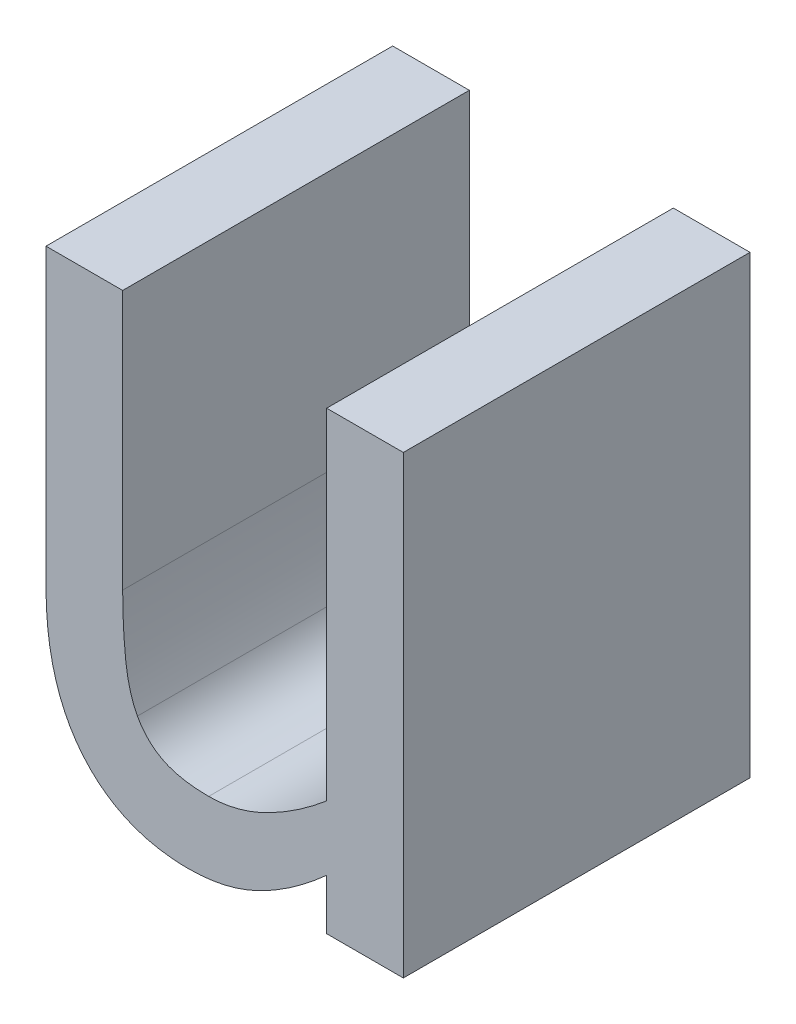
ISO-10303-21;
HEADER;
FILE_DESCRIPTION(('STEP AP214'),'2;1');
FILE_NAME('part.step','',(''),(''),'','','');
FILE_SCHEMA(('AUTOMOTIVE_DESIGN { 1 0 10303 214 1 1 1 1 }'));
ENDSEC;
DATA;
#1=APPLICATION_CONTEXT('core data for automotive mechanical design processes');
#2=APPLICATION_PROTOCOL_DEFINITION('international standard','automotive_design',2000,#1);
#3=PRODUCT_CONTEXT('',#1,'mechanical');
#4=PRODUCT('Part','Part','',(#3));
#5=PRODUCT_RELATED_PRODUCT_CATEGORY('part','',(#4));
#6=PRODUCT_DEFINITION_FORMATION('','',#4);
#7=PRODUCT_DEFINITION_CONTEXT('part definition',#1,'design');
#8=PRODUCT_DEFINITION('design','',#6,#7);
#9=PRODUCT_DEFINITION_SHAPE('','',#8);
#10=(LENGTH_UNIT() NAMED_UNIT(*) SI_UNIT(.MILLI.,.METRE.));
#11=(NAMED_UNIT(*) PLANE_ANGLE_UNIT() SI_UNIT($,.RADIAN.));
#12=(NAMED_UNIT(*) SI_UNIT($,.STERADIAN.) SOLID_ANGLE_UNIT());
#13=UNCERTAINTY_MEASURE_WITH_UNIT(LENGTH_MEASURE(1.E-05),#10,'distance_accuracy_value','');
#14=(GEOMETRIC_REPRESENTATION_CONTEXT(3) GLOBAL_UNCERTAINTY_ASSIGNED_CONTEXT((#13)) GLOBAL_UNIT_ASSIGNED_CONTEXT((#10,
#11,#12)) REPRESENTATION_CONTEXT('',''));
#15=CARTESIAN_POINT('',(0.,0.,0.));
#16=DIRECTION('',(0.,0.,1.));
#17=DIRECTION('',(1.,0.,0.));
#18=AXIS2_PLACEMENT_3D('',#15,#16,#17);
#19=CARTESIAN_POINT('',(6.1315331595473,1.5792761071792,0.));
#20=DIRECTION('',(1.,0.,0.));
#21=DIRECTION('',(0.,1.,0.));
#22=AXIS2_PLACEMENT_3D('',#19,#20,#21);
#23=PLANE('',#22);
#24=DIRECTION('',(0.,-1.,0.));
#25=VECTOR('',#24,1.);
#26=CARTESIAN_POINT('',(6.1315331595473,1.6541374403639,0.));
#27=LINE('',#26,#25);
#28=CARTESIAN_POINT('',(6.1315331595473,1.6541374403639,0.));
#29=VERTEX_POINT('',#28);
#30=CARTESIAN_POINT('',(6.1315331595473,1.5792761071792,0.));
#31=VERTEX_POINT('',#30);
#32=EDGE_CURVE('E11',#29,#31,#27,.T.);
#33=ORIENTED_EDGE('',*,*,#32,.F.);
#34=DIRECTION('',(0.,0.,1.));
#35=VECTOR('',#34,1.);
#36=CARTESIAN_POINT('',(6.1315331595473,1.6541374403639,0.));
#37=LINE('',#36,#35);
#38=CARTESIAN_POINT('',(6.1315331595473,1.6541374403639,0.1));
#39=VERTEX_POINT('',#38);
#40=EDGE_CURVE('E24',#29,#39,#37,.T.);
#41=ORIENTED_EDGE('',*,*,#40,.T.);
#42=DIRECTION('',(0.,1.,0.));
#43=VECTOR('',#42,1.);
#44=CARTESIAN_POINT('',(6.1315331595473,1.6541374403639,0.1));
#45=LINE('',#44,#43);
#46=CARTESIAN_POINT('',(6.1315331595473,1.5792761071792,0.1));
#47=VERTEX_POINT('',#46);
#48=EDGE_CURVE('E130',#47,#39,#45,.T.);
#49=ORIENTED_EDGE('',*,*,#48,.F.);
#50=DIRECTION('',(0.,0.,1.));
#51=VECTOR('',#50,1.);
#52=CARTESIAN_POINT('',(6.1315331595473,1.5792761071792,0.));
#53=LINE('',#52,#51);
#54=EDGE_CURVE('E258',#31,#47,#53,.T.);
#55=ORIENTED_EDGE('',*,*,#54,.F.);
#56=EDGE_LOOP('',(#33,#41,#49,#55));
#57=FACE_BOUND('',#56,.T.);
#58=ADVANCED_FACE('F17',(#57),#23,.T.);
#59=CARTESIAN_POINT('',(6.1357866443874,1.5499270617829,0.));
#60=CARTESIAN_POINT('',(6.1357866443874,1.5499270617829,0.1));
#61=CARTESIAN_POINT('',(6.1332345534833,1.5546058951069,0.));
#62=CARTESIAN_POINT('',(6.1332345534833,1.5546058951069,0.1));
#63=CARTESIAN_POINT('',(6.1315331595473,1.5702020061871,0.));
#64=CARTESIAN_POINT('',(6.1315331595473,1.5702020061871,0.1));
#65=CARTESIAN_POINT('',(6.1315331595473,1.5792761071792,0.));
#66=CARTESIAN_POINT('',(6.1315331595473,1.5792761071792,0.1));
#67=B_SPLINE_SURFACE_WITH_KNOTS('',2,1,((#59,#60),(#61,#62),(#63,#64),(#65,#66)),.UNSPECIFIED.,
.F.,.F.,.F.,(3,1,3),(2,2),(-2.,-1.,0.),(0.,0.01),.UNSPECIFIED.);
#68=CARTESIAN_POINT('',(6.1315331595473,1.5792761071792,0.));
#69=CARTESIAN_POINT('',(6.1315331595473,1.5702020061871,0.));
#70=CARTESIAN_POINT('',(6.1332345534833,1.5546058951069,0.));
#71=CARTESIAN_POINT('',(6.1357866443874,1.5499270617829,0.));
#72=B_SPLINE_CURVE_WITH_KNOTS('',2,(#68,#69,#70,#71),.UNSPECIFIED.,.F.,.F.,(3,1,3),(0.,1.,2.),.UNSPECIFIED.);
#73=CARTESIAN_POINT('',(6.1357866443874,1.5499270617829,0.));
#74=VERTEX_POINT('',#73);
#75=EDGE_CURVE('E251',#31,#74,#72,.T.);
#76=CARTESIAN_POINT('',(6.1357866443874,1.5499270617829,0.1));
#77=CARTESIAN_POINT('',(6.1332345534833,1.5546058951069,0.1));
#78=CARTESIAN_POINT('',(6.1315331595473,1.5702020061871,0.1));
#79=CARTESIAN_POINT('',(6.1315331595473,1.5792761071792,0.1));
#80=B_SPLINE_CURVE_WITH_KNOTS('',2,(#76,#77,#78,#79),.UNSPECIFIED.,.F.,.F.,(3,1,3),(-2.,-1.,0.),.UNSPECIFIED.);
#81=CARTESIAN_POINT('',(6.1357866443874,1.5499270617829,0.1));
#82=VERTEX_POINT('',#81);
#83=EDGE_CURVE('E247',#82,#47,#80,.T.);
#84=DIRECTION('',(0.,0.,1.));
#85=VECTOR('',#84,1.);
#86=CARTESIAN_POINT('',(6.1357866443874,1.5499270617829,0.));
#87=LINE('',#86,#85);
#88=EDGE_CURVE('E241',#74,#82,#87,.T.);
#89=ORIENTED_EDGE('',*,*,#75,.F.);
#90=ORIENTED_EDGE('',*,*,#54,.T.);
#91=ORIENTED_EDGE('',*,*,#83,.F.);
#92=ORIENTED_EDGE('',*,*,#88,.F.);
#93=EDGE_LOOP('',(#89,#90,#91,#92));
#94=FACE_BOUND('',#93,.T.);
#95=ADVANCED_FACE('F303',(#94),#67,.T.);
#96=CARTESIAN_POINT('',(6.1563451544476,1.5401440466508,0.));
#97=CARTESIAN_POINT('',(6.1563451544476,1.5401440466508,0.1));
#98=CARTESIAN_POINT('',(6.1481217504235,1.5401440466508,0.));
#99=CARTESIAN_POINT('',(6.1481217504235,1.5401440466508,0.1));
#100=CARTESIAN_POINT('',(6.1384805181194,1.5449646628028,0.));
#101=CARTESIAN_POINT('',(6.1384805181194,1.5449646628028,0.1));
#102=CARTESIAN_POINT('',(6.1357866443874,1.5499270617829,0.));
#103=CARTESIAN_POINT('',(6.1357866443874,1.5499270617829,0.1));
#104=B_SPLINE_SURFACE_WITH_KNOTS('',2,1,((#96,#97),(#98,#99),(#100,#101),(#102,#103)),
.UNSPECIFIED.,.F.,.F.,.F.,(3,1,3),(2,2),(-2.,-1.,0.),(0.,0.01),.UNSPECIFIED.);
#105=CARTESIAN_POINT('',(6.1357866443874,1.5499270617829,0.));
#106=CARTESIAN_POINT('',(6.1384805181194,1.5449646628028,0.));
#107=CARTESIAN_POINT('',(6.1481217504235,1.5401440466508,0.));
#108=CARTESIAN_POINT('',(6.1563451544476,1.5401440466508,0.));
#109=B_SPLINE_CURVE_WITH_KNOTS('',2,(#105,#106,#107,#108),.UNSPECIFIED.,.F.,.F.,(3,1,3),(0.,1.,
2.),.UNSPECIFIED.);
#110=CARTESIAN_POINT('',(6.1563451544476,1.5401440466508,0.));
#111=VERTEX_POINT('',#110);
#112=EDGE_CURVE('E234',#74,#111,#109,.T.);
#113=CARTESIAN_POINT('',(6.1563451544476,1.5401440466508,0.1));
#114=CARTESIAN_POINT('',(6.1481217504235,1.5401440466508,0.1));
#115=CARTESIAN_POINT('',(6.1384805181194,1.5449646628028,0.1));
#116=CARTESIAN_POINT('',(6.1357866443874,1.5499270617829,0.1));
#117=B_SPLINE_CURVE_WITH_KNOTS('',2,(#113,#114,#115,#116),.UNSPECIFIED.,.F.,.F.,(3,1,3),(-2.,
-1.,0.),.UNSPECIFIED.);
#118=CARTESIAN_POINT('',(6.1563451544476,1.5401440466508,0.1));
#119=VERTEX_POINT('',#118);
#120=EDGE_CURVE('E229',#119,#82,#117,.T.);
#121=DIRECTION('',(0.,0.,1.));
#122=VECTOR('',#121,1.);
#123=CARTESIAN_POINT('',(6.1563451544476,1.5401440466508,0.));
#124=LINE('',#123,#122);
#125=EDGE_CURVE('E223',#111,#119,#124,.T.);
#126=ORIENTED_EDGE('',*,*,#112,.F.);
#127=ORIENTED_EDGE('',*,*,#88,.T.);
#128=ORIENTED_EDGE('',*,*,#120,.F.);
#129=ORIENTED_EDGE('',*,*,#125,.F.);
#130=EDGE_LOOP('',(#126,#127,#128,#129));
#131=FACE_BOUND('',#130,.T.);
#132=ADVANCED_FACE('F299',(#131),#104,.T.);
#133=CARTESIAN_POINT('',(6.1903730331679,1.5560237233869,0.));
#134=CARTESIAN_POINT('',(6.1903730331679,1.5560237233869,0.1));
#135=CARTESIAN_POINT('',(6.1820078463158,1.5489345819869,0.));
#136=CARTESIAN_POINT('',(6.1820078463158,1.5489345819869,0.1));
#137=CARTESIAN_POINT('',(6.1645685584717,1.5401440466508,0.));
#138=CARTESIAN_POINT('',(6.1645685584717,1.5401440466508,0.1));
#139=CARTESIAN_POINT('',(6.1563451544476,1.5401440466508,0.));
#140=CARTESIAN_POINT('',(6.1563451544476,1.5401440466508,0.1));
#141=B_SPLINE_SURFACE_WITH_KNOTS('',2,1,((#133,#134),(#135,#136),(#137,#138),(#139,#140)),
.UNSPECIFIED.,.F.,.F.,.F.,(3,1,3),(2,2),(-2.,-1.,0.),(0.,0.01),.UNSPECIFIED.);
#142=CARTESIAN_POINT('',(6.1563451544476,1.5401440466508,0.));
#143=CARTESIAN_POINT('',(6.1645685584717,1.5401440466508,0.));
#144=CARTESIAN_POINT('',(6.1820078463158,1.5489345819869,0.));
#145=CARTESIAN_POINT('',(6.1903730331679,1.5560237233869,0.));
#146=B_SPLINE_CURVE_WITH_KNOTS('',2,(#142,#143,#144,#145),.UNSPECIFIED.,.F.,.F.,(3,1,3),(0.,1.,
2.),.UNSPECIFIED.);
#147=CARTESIAN_POINT('',(6.1903730331679,1.5560237233869,0.));
#148=VERTEX_POINT('',#147);
#149=EDGE_CURVE('E216',#111,#148,#146,.T.);
#150=CARTESIAN_POINT('',(6.1903730331679,1.5560237233869,0.1));
#151=CARTESIAN_POINT('',(6.1820078463158,1.5489345819869,0.1));
#152=CARTESIAN_POINT('',(6.1645685584717,1.5401440466508,0.1));
#153=CARTESIAN_POINT('',(6.1563451544476,1.5401440466508,0.1));
#154=B_SPLINE_CURVE_WITH_KNOTS('',2,(#150,#151,#152,#153),.UNSPECIFIED.,.F.,.F.,(3,1,3),(-2.,
-1.,0.),.UNSPECIFIED.);
#155=CARTESIAN_POINT('',(6.1903730331679,1.5560237233869,0.1));
#156=VERTEX_POINT('',#155);
#157=EDGE_CURVE('E211',#156,#119,#154,.T.);
#158=DIRECTION('',(0.,0.,1.));
#159=VECTOR('',#158,1.);
#160=CARTESIAN_POINT('',(6.1903730331679,1.5560237233869,0.));
#161=LINE('',#160,#159);
#162=EDGE_CURVE('E208',#148,#156,#161,.T.);
#163=ORIENTED_EDGE('',*,*,#149,.F.);
#164=ORIENTED_EDGE('',*,*,#125,.T.);
#165=ORIENTED_EDGE('',*,*,#157,.F.);
#166=ORIENTED_EDGE('',*,*,#162,.F.);
#167=EDGE_LOOP('',(#163,#164,#165,#166));
#168=FACE_BOUND('',#167,.T.);
#169=ADVANCED_FACE('F295',(#168),#141,.T.);
#170=CARTESIAN_POINT('',(6.1903730331679,1.6541374403639,0.));
#171=DIRECTION('',(-1.,0.,0.));
#172=DIRECTION('',(0.,-1.,0.));
#173=AXIS2_PLACEMENT_3D('',#170,#171,#172);
#174=PLANE('',#173);
#175=DIRECTION('',(0.,1.,0.));
#176=VECTOR('',#175,1.);
#177=CARTESIAN_POINT('',(6.1903730331679,1.5560237233869,0.));
#178=LINE('',#177,#176);
#179=CARTESIAN_POINT('',(6.1903730331679,1.6541374403639,0.));
#180=VERTEX_POINT('',#179);
#181=EDGE_CURVE('E206',#148,#180,#178,.T.);
#182=ORIENTED_EDGE('',*,*,#181,.F.);
#183=ORIENTED_EDGE('',*,*,#162,.T.);
#184=DIRECTION('',(0.,-1.,0.));
#185=VECTOR('',#184,1.);
#186=CARTESIAN_POINT('',(6.1903730331679,1.5560237233869,0.1));
#187=LINE('',#186,#185);
#188=CARTESIAN_POINT('',(6.1903730331679,1.6541374403639,0.1));
#189=VERTEX_POINT('',#188);
#190=EDGE_CURVE('E203',#189,#156,#187,.T.);
#191=ORIENTED_EDGE('',*,*,#190,.F.);
#192=DIRECTION('',(0.,0.,1.));
#193=VECTOR('',#192,1.);
#194=CARTESIAN_POINT('',(6.1903730331679,1.6541374403639,0.));
#195=LINE('',#194,#193);
#196=EDGE_CURVE('E200',#180,#189,#195,.T.);
#197=ORIENTED_EDGE('',*,*,#196,.F.);
#198=EDGE_LOOP('',(#182,#183,#191,#197));
#199=FACE_BOUND('',#198,.T.);
#200=ADVANCED_FACE('F291',(#199),#174,.T.);
#201=CARTESIAN_POINT('',(6.2124911543361,1.6541374403639,0.));
#202=DIRECTION('',(0.,1.,0.));
#203=DIRECTION('',(-1.,0.,0.));
#204=AXIS2_PLACEMENT_3D('',#201,#202,#203);
#205=PLANE('',#204);
#206=DIRECTION('',(1.,0.,0.));
#207=VECTOR('',#206,1.);
#208=CARTESIAN_POINT('',(6.1903730331679,1.6541374403639,0.));
#209=LINE('',#208,#207);
#210=CARTESIAN_POINT('',(6.2124911543361,1.6541374403639,0.));
#211=VERTEX_POINT('',#210);
#212=EDGE_CURVE('E198',#180,#211,#209,.T.);
#213=ORIENTED_EDGE('',*,*,#212,.F.);
#214=ORIENTED_EDGE('',*,*,#196,.T.);
#215=DIRECTION('',(-1.,0.,0.));
#216=VECTOR('',#215,1.);
#217=CARTESIAN_POINT('',(6.1903730331679,1.6541374403639,0.1));
#218=LINE('',#217,#216);
#219=CARTESIAN_POINT('',(6.2124911543361,1.6541374403639,0.1));
#220=VERTEX_POINT('',#219);
#221=EDGE_CURVE('E195',#220,#189,#218,.T.);
#222=ORIENTED_EDGE('',*,*,#221,.F.);
#223=DIRECTION('',(0.,0.,1.));
#224=VECTOR('',#223,1.);
#225=CARTESIAN_POINT('',(6.2124911543361,1.6541374403639,0.));
#226=LINE('',#225,#224);
#227=EDGE_CURVE('E192',#211,#220,#226,.T.);
#228=ORIENTED_EDGE('',*,*,#227,.F.);
#229=EDGE_LOOP('',(#213,#214,#222,#228));
#230=FACE_BOUND('',#229,.T.);
#231=ADVANCED_FACE('F287',(#230),#205,.T.);
#232=CARTESIAN_POINT('',(6.2124911543361,1.5228465416346,0.));
#233=DIRECTION('',(1.,0.,0.));
#234=DIRECTION('',(0.,1.,0.));
#235=AXIS2_PLACEMENT_3D('',#232,#233,#234);
#236=PLANE('',#235);
#237=DIRECTION('',(0.,-1.,0.));
#238=VECTOR('',#237,1.);
#239=CARTESIAN_POINT('',(6.2124911543361,1.6541374403639,0.));
#240=LINE('',#239,#238);
#241=CARTESIAN_POINT('',(6.2124911543361,1.5228465416346,0.));
#242=VERTEX_POINT('',#241);
#243=EDGE_CURVE('E190',#211,#242,#240,.T.);
#244=ORIENTED_EDGE('',*,*,#243,.F.);
#245=ORIENTED_EDGE('',*,*,#227,.T.);
#246=DIRECTION('',(0.,1.,0.));
#247=VECTOR('',#246,1.);
#248=CARTESIAN_POINT('',(6.2124911543361,1.6541374403639,0.1));
#249=LINE('',#248,#247);
#250=CARTESIAN_POINT('',(6.2124911543361,1.5228465416346,0.1));
#251=VERTEX_POINT('',#250);
#252=EDGE_CURVE('E187',#251,#220,#249,.T.);
#253=ORIENTED_EDGE('',*,*,#252,.F.);
#254=DIRECTION('',(0.,0.,1.));
#255=VECTOR('',#254,1.);
#256=CARTESIAN_POINT('',(6.2124911543361,1.5228465416346,0.));
#257=LINE('',#256,#255);
#258=EDGE_CURVE('E184',#242,#251,#257,.T.);
#259=ORIENTED_EDGE('',*,*,#258,.F.);
#260=EDGE_LOOP('',(#244,#245,#253,#259));
#261=FACE_BOUND('',#260,.T.);
#262=ADVANCED_FACE('F283',(#261),#236,.T.);
#263=CARTESIAN_POINT('',(6.1903730331679,1.5228465416346,0.));
#264=DIRECTION('',(0.,-1.,0.));
#265=DIRECTION('',(1.,0.,0.));
#266=AXIS2_PLACEMENT_3D('',#263,#264,#265);
#267=PLANE('',#266);
#268=DIRECTION('',(-1.,0.,0.));
#269=VECTOR('',#268,1.);
#270=CARTESIAN_POINT('',(6.2124911543361,1.5228465416346,0.));
#271=LINE('',#270,#269);
#272=CARTESIAN_POINT('',(6.1903730331679,1.5228465416346,0.));
#273=VERTEX_POINT('',#272);
#274=EDGE_CURVE('E182',#242,#273,#271,.T.);
#275=ORIENTED_EDGE('',*,*,#274,.F.);
#276=ORIENTED_EDGE('',*,*,#258,.T.);
#277=DIRECTION('',(1.,0.,0.));
#278=VECTOR('',#277,1.);
#279=CARTESIAN_POINT('',(6.2124911543361,1.5228465416346,0.1));
#280=LINE('',#279,#278);
#281=CARTESIAN_POINT('',(6.1903730331679,1.5228465416346,0.1));
#282=VERTEX_POINT('',#281);
#283=EDGE_CURVE('E179',#282,#251,#280,.T.);
#284=ORIENTED_EDGE('',*,*,#283,.F.);
#285=DIRECTION('',(0.,0.,1.));
#286=VECTOR('',#285,1.);
#287=CARTESIAN_POINT('',(6.1903730331679,1.5228465416346,0.));
#288=LINE('',#287,#286);
#289=EDGE_CURVE('E176',#273,#282,#288,.T.);
#290=ORIENTED_EDGE('',*,*,#289,.F.);
#291=EDGE_LOOP('',(#275,#276,#284,#290));
#292=FACE_BOUND('',#291,.T.);
#293=ADVANCED_FACE('F279',(#292),#267,.T.);
#294=CARTESIAN_POINT('',(6.1903730331679,1.5374501729188,0.));
#295=DIRECTION('',(-1.,0.,0.));
#296=DIRECTION('',(0.,-1.,0.));
#297=AXIS2_PLACEMENT_3D('',#294,#295,#296);
#298=PLANE('',#297);
#299=DIRECTION('',(0.,1.,0.));
#300=VECTOR('',#299,1.);
#301=CARTESIAN_POINT('',(6.1903730331679,1.5228465416346,0.));
#302=LINE('',#301,#300);
#303=CARTESIAN_POINT('',(6.1903730331679,1.5374501729188,0.));
#304=VERTEX_POINT('',#303);
#305=EDGE_CURVE('E174',#273,#304,#302,.T.);
#306=ORIENTED_EDGE('',*,*,#305,.F.);
#307=ORIENTED_EDGE('',*,*,#289,.T.);
#308=DIRECTION('',(0.,-1.,0.));
#309=VECTOR('',#308,1.);
#310=CARTESIAN_POINT('',(6.1903730331679,1.5228465416346,0.1));
#311=LINE('',#310,#309);
#312=CARTESIAN_POINT('',(6.1903730331679,1.5374501729188,0.1));
#313=VERTEX_POINT('',#312);
#314=EDGE_CURVE('E171',#313,#282,#311,.T.);
#315=ORIENTED_EDGE('',*,*,#314,.F.);
#316=DIRECTION('',(0.,0.,1.));
#317=VECTOR('',#316,1.);
#318=CARTESIAN_POINT('',(6.1903730331679,1.5374501729188,0.));
#319=LINE('',#318,#317);
#320=EDGE_CURVE('E165',#304,#313,#319,.T.);
#321=ORIENTED_EDGE('',*,*,#320,.F.);
#322=EDGE_LOOP('',(#306,#307,#315,#321));
#323=FACE_BOUND('',#322,.T.);
#324=ADVANCED_FACE('F275',(#323),#298,.T.);
#325=CARTESIAN_POINT('',(6.1505320584995,1.5191601881066,0.));
#326=CARTESIAN_POINT('',(6.1505320584995,1.5191601881066,0.1));
#327=CARTESIAN_POINT('',(6.1613075534276,1.5191601881066,0.));
#328=CARTESIAN_POINT('',(6.1613075534276,1.5191601881066,0.1));
#329=CARTESIAN_POINT('',(6.1804482352078,1.5285178547547,0.));
#330=CARTESIAN_POINT('',(6.1804482352078,1.5285178547547,0.1));
#331=CARTESIAN_POINT('',(6.1903730331679,1.5374501729188,0.));
#332=CARTESIAN_POINT('',(6.1903730331679,1.5374501729188,0.1));
#333=B_SPLINE_SURFACE_WITH_KNOTS('',2,1,((#325,#326),(#327,#328),(#329,#330),(#331,#332)),
.UNSPECIFIED.,.F.,.F.,.F.,(3,1,3),(2,2),(-2.,-1.,0.),(0.,0.01),.UNSPECIFIED.);
#334=CARTESIAN_POINT('',(6.1903730331679,1.5374501729188,0.));
#335=CARTESIAN_POINT('',(6.1804482352078,1.5285178547547,0.));
#336=CARTESIAN_POINT('',(6.1613075534276,1.5191601881066,0.));
#337=CARTESIAN_POINT('',(6.1505320584995,1.5191601881066,0.));
#338=B_SPLINE_CURVE_WITH_KNOTS('',2,(#334,#335,#336,#337),.UNSPECIFIED.,.F.,.F.,(3,1,3),(0.,1.,
2.),.UNSPECIFIED.);
#339=CARTESIAN_POINT('',(6.1505320584995,1.5191601881066,0.));
#340=VERTEX_POINT('',#339);
#341=EDGE_CURVE('E158',#304,#340,#338,.T.);
#342=CARTESIAN_POINT('',(6.1505320584995,1.5191601881066,0.1));
#343=CARTESIAN_POINT('',(6.1613075534276,1.5191601881066,0.1));
#344=CARTESIAN_POINT('',(6.1804482352078,1.5285178547547,0.1));
#345=CARTESIAN_POINT('',(6.1903730331679,1.5374501729188,0.1));
#346=B_SPLINE_CURVE_WITH_KNOTS('',2,(#342,#343,#344,#345),.UNSPECIFIED.,.F.,.F.,(3,1,3),(-2.,
-1.,0.),.UNSPECIFIED.);
#347=CARTESIAN_POINT('',(6.1505320584995,1.5191601881066,0.1));
#348=VERTEX_POINT('',#347);
#349=EDGE_CURVE('E153',#348,#313,#346,.T.);
#350=DIRECTION('',(0.,0.,1.));
#351=VECTOR('',#350,1.);
#352=CARTESIAN_POINT('',(6.1505320584995,1.5191601881066,0.));
#353=LINE('',#352,#351);
#354=EDGE_CURVE('E147',#340,#348,#353,.T.);
#355=ORIENTED_EDGE('',*,*,#341,.F.);
#356=ORIENTED_EDGE('',*,*,#320,.T.);
#357=ORIENTED_EDGE('',*,*,#349,.F.);
#358=ORIENTED_EDGE('',*,*,#354,.F.);
#359=EDGE_LOOP('',(#355,#356,#357,#358));
#360=FACE_BOUND('',#359,.T.);
#361=ADVANCED_FACE('F271',(#360),#333,.T.);
#362=CARTESIAN_POINT('',(6.1094150383791,1.5689259607351,0.));
#363=CARTESIAN_POINT('',(6.1094150383791,1.5689259607351,0.1));
#364=CARTESIAN_POINT('',(6.1094150383791,1.5446810971468,0.));
#365=CARTESIAN_POINT('',(6.1094150383791,1.5446810971468,0.1));
#366=CARTESIAN_POINT('',(6.1312495938913,1.5191601881066,0.));
#367=CARTESIAN_POINT('',(6.1312495938913,1.5191601881066,0.1));
#368=CARTESIAN_POINT('',(6.1505320584995,1.5191601881066,0.));
#369=CARTESIAN_POINT('',(6.1505320584995,1.5191601881066,0.1));
#370=B_SPLINE_SURFACE_WITH_KNOTS('',2,1,((#362,#363),(#364,#365),(#366,#367),(#368,#369)),
.UNSPECIFIED.,.F.,.F.,.F.,(3,1,3),(2,2),(-2.,-1.,0.),(0.,0.01),.UNSPECIFIED.);
#371=CARTESIAN_POINT('',(6.1505320584995,1.5191601881066,0.));
#372=CARTESIAN_POINT('',(6.1312495938913,1.5191601881066,0.));
#373=CARTESIAN_POINT('',(6.1094150383791,1.5446810971468,0.));
#374=CARTESIAN_POINT('',(6.1094150383791,1.5689259607351,0.));
#375=B_SPLINE_CURVE_WITH_KNOTS('',2,(#371,#372,#373,#374),.UNSPECIFIED.,.F.,.F.,(3,1,3),(0.,1.,
2.),.UNSPECIFIED.);
#376=CARTESIAN_POINT('',(6.1094150383791,1.5689259607351,0.));
#377=VERTEX_POINT('',#376);
#378=EDGE_CURVE('E140',#340,#377,#375,.T.);
#379=CARTESIAN_POINT('',(6.1094150383791,1.5689259607351,0.1));
#380=CARTESIAN_POINT('',(6.1094150383791,1.5446810971468,0.1));
#381=CARTESIAN_POINT('',(6.1312495938913,1.5191601881066,0.1));
#382=CARTESIAN_POINT('',(6.1505320584995,1.5191601881066,0.1));
#383=B_SPLINE_CURVE_WITH_KNOTS('',2,(#379,#380,#381,#382),.UNSPECIFIED.,.F.,.F.,(3,1,3),(-2.,
-1.,0.),.UNSPECIFIED.);
#384=CARTESIAN_POINT('',(6.1094150383791,1.5689259607351,0.1));
#385=VERTEX_POINT('',#384);
#386=EDGE_CURVE('E136',#385,#348,#383,.T.);
#387=DIRECTION('',(0.,0.,1.));
#388=VECTOR('',#387,1.);
#389=CARTESIAN_POINT('',(6.1094150383791,1.5689259607351,0.));
#390=LINE('',#389,#388);
#391=EDGE_CURVE('E115',#377,#385,#390,.T.);
#392=ORIENTED_EDGE('',*,*,#378,.F.);
#393=ORIENTED_EDGE('',*,*,#354,.T.);
#394=ORIENTED_EDGE('',*,*,#386,.F.);
#395=ORIENTED_EDGE('',*,*,#391,.F.);
#396=EDGE_LOOP('',(#392,#393,#394,#395));
#397=FACE_BOUND('',#396,.T.);
#398=ADVANCED_FACE('F269',(#397),#370,.T.);
#399=CARTESIAN_POINT('',(6.1094150383791,1.6541374403639,0.));
#400=DIRECTION('',(-1.,0.,0.));
#401=DIRECTION('',(0.,-1.,0.));
#402=AXIS2_PLACEMENT_3D('',#399,#400,#401);
#403=PLANE('',#402);
#404=DIRECTION('',(0.,1.,0.));
#405=VECTOR('',#404,1.);
#406=CARTESIAN_POINT('',(6.1094150383791,1.5689259607351,0.));
#407=LINE('',#406,#405);
#408=CARTESIAN_POINT('',(6.1094150383791,1.6541374403639,0.));
#409=VERTEX_POINT('',#408);
#410=EDGE_CURVE('E119',#377,#409,#407,.T.);
#411=ORIENTED_EDGE('',*,*,#410,.F.);
#412=ORIENTED_EDGE('',*,*,#391,.T.);
#413=DIRECTION('',(0.,-1.,0.));
#414=VECTOR('',#413,1.);
#415=CARTESIAN_POINT('',(6.1094150383791,1.5689259607351,0.1));
#416=LINE('',#415,#414);
#417=CARTESIAN_POINT('',(6.1094150383791,1.6541374403639,0.1));
#418=VERTEX_POINT('',#417);
#419=EDGE_CURVE('E108',#418,#385,#416,.T.);
#420=ORIENTED_EDGE('',*,*,#419,.F.);
#421=DIRECTION('',(0.,0.,1.));
#422=VECTOR('',#421,1.);
#423=CARTESIAN_POINT('',(6.1094150383791,1.6541374403639,0.));
#424=LINE('',#423,#422);
#425=EDGE_CURVE('E112',#409,#418,#424,.T.);
#426=ORIENTED_EDGE('',*,*,#425,.F.);
#427=EDGE_LOOP('',(#411,#412,#420,#426));
#428=FACE_BOUND('',#427,.T.);
#429=ADVANCED_FACE('F111',(#428),#403,.T.);
#430=CARTESIAN_POINT('',(6.1315331595473,1.6541374403639,0.));
#431=DIRECTION('',(0.,1.,0.));
#432=DIRECTION('',(-1.,0.,0.));
#433=AXIS2_PLACEMENT_3D('',#430,#431,#432);
#434=PLANE('',#433);
#435=DIRECTION('',(1.,0.,0.));
#436=VECTOR('',#435,1.);
#437=CARTESIAN_POINT('',(6.1094150383791,1.6541374403639,0.));
#438=LINE('',#437,#436);
#439=EDGE_CURVE('E125',#409,#29,#438,.T.);
#440=ORIENTED_EDGE('',*,*,#439,.F.);
#441=ORIENTED_EDGE('',*,*,#425,.T.);
#442=DIRECTION('',(-1.,0.,0.));
#443=VECTOR('',#442,1.);
#444=CARTESIAN_POINT('',(6.1094150383791,1.6541374403639,0.1));
#445=LINE('',#444,#443);
#446=EDGE_CURVE('E124',#39,#418,#445,.T.);
#447=ORIENTED_EDGE('',*,*,#446,.F.);
#448=ORIENTED_EDGE('',*,*,#40,.F.);
#449=EDGE_LOOP('',(#440,#441,#447,#448));
#450=FACE_BOUND('',#449,.T.);
#451=ADVANCED_FACE('F123',(#450),#434,.T.);
#452=CARTESIAN_POINT('',(6.1642917463908,1.5865954128889,0.));
#453=DIRECTION('',(0.,0.,1.));
#454=DIRECTION('',(1.,0.,0.));
#455=AXIS2_PLACEMENT_3D('',#452,#453,#454);
#456=PLANE('',#455);
#457=ORIENTED_EDGE('',*,*,#439,.T.);
#458=ORIENTED_EDGE('',*,*,#32,.T.);
#459=ORIENTED_EDGE('',*,*,#75,.T.);
#460=ORIENTED_EDGE('',*,*,#112,.T.);
#461=ORIENTED_EDGE('',*,*,#149,.T.);
#462=ORIENTED_EDGE('',*,*,#181,.T.);
#463=ORIENTED_EDGE('',*,*,#212,.T.);
#464=ORIENTED_EDGE('',*,*,#243,.T.);
#465=ORIENTED_EDGE('',*,*,#274,.T.);
#466=ORIENTED_EDGE('',*,*,#305,.T.);
#467=ORIENTED_EDGE('',*,*,#341,.T.);
#468=ORIENTED_EDGE('',*,*,#378,.T.);
#469=ORIENTED_EDGE('',*,*,#410,.T.);
#470=EDGE_LOOP('',(#457,#458,#459,#460,#461,#462,#463,#464,#465,#466,#467,#468,#469));
#471=FACE_BOUND('',#470,.T.);
#472=ADVANCED_FACE('F264',(#471),#456,.F.);
#473=CARTESIAN_POINT('',(6.1642917463908,1.5865954128889,0.1));
#474=DIRECTION('',(0.,0.,1.));
#475=DIRECTION('',(1.,0.,0.));
#476=AXIS2_PLACEMENT_3D('',#473,#474,#475);
#477=PLANE('',#476);
#478=ORIENTED_EDGE('',*,*,#446,.T.);
#479=ORIENTED_EDGE('',*,*,#419,.T.);
#480=ORIENTED_EDGE('',*,*,#386,.T.);
#481=ORIENTED_EDGE('',*,*,#349,.T.);
#482=ORIENTED_EDGE('',*,*,#314,.T.);
#483=ORIENTED_EDGE('',*,*,#283,.T.);
#484=ORIENTED_EDGE('',*,*,#252,.T.);
#485=ORIENTED_EDGE('',*,*,#221,.T.);
#486=ORIENTED_EDGE('',*,*,#190,.T.);
#487=ORIENTED_EDGE('',*,*,#157,.T.);
#488=ORIENTED_EDGE('',*,*,#120,.T.);
#489=ORIENTED_EDGE('',*,*,#83,.T.);
#490=ORIENTED_EDGE('',*,*,#48,.T.);
#491=EDGE_LOOP('',(#478,#479,#480,#481,#482,#483,#484,#485,#486,#487,#488,#489,#490));
#492=FACE_BOUND('',#491,.T.);
#493=ADVANCED_FACE('F128',(#492),#477,.T.);
#494=CLOSED_SHELL('',(#58,#95,#132,#169,#200,#231,#262,#293,#324,#361,#398,#429,#451,#472,#493));
#495=MANIFOLD_SOLID_BREP('B1',#494);
#496=ADVANCED_BREP_SHAPE_REPRESENTATION('',(#18,#495),#14);
#497=SHAPE_DEFINITION_REPRESENTATION(#9,#496);
ENDSEC;
END-ISO-10303-21;
